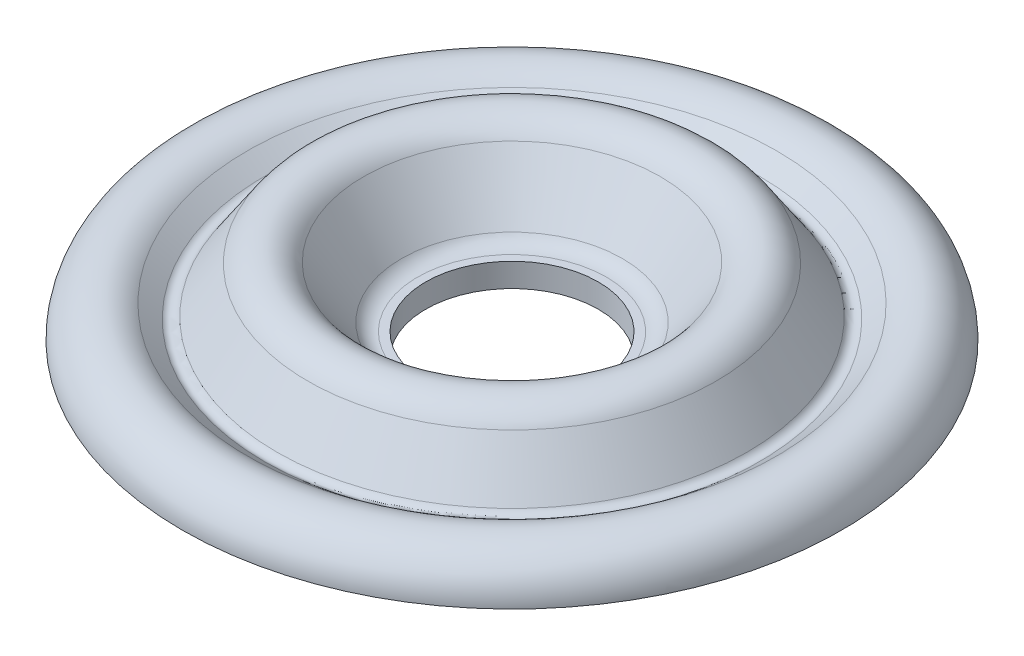
ISO-10303-21;
HEADER;
FILE_DESCRIPTION(('STEP AP214'),'2;1');
FILE_NAME('part.step','',(''),(''),'','','');
FILE_SCHEMA(('AUTOMOTIVE_DESIGN { 1 0 10303 214 1 1 1 1 }'));
ENDSEC;
DATA;
#1=APPLICATION_CONTEXT('core data for automotive mechanical design processes');
#2=APPLICATION_PROTOCOL_DEFINITION('international standard','automotive_design',2000,#1);
#3=PRODUCT_CONTEXT('',#1,'mechanical');
#4=PRODUCT('Part','Part','',(#3));
#5=PRODUCT_RELATED_PRODUCT_CATEGORY('part','',(#4));
#6=PRODUCT_DEFINITION_FORMATION('','',#4);
#7=PRODUCT_DEFINITION_CONTEXT('part definition',#1,'design');
#8=PRODUCT_DEFINITION('design','',#6,#7);
#9=PRODUCT_DEFINITION_SHAPE('','',#8);
#10=(LENGTH_UNIT() NAMED_UNIT(*) SI_UNIT(.MILLI.,.METRE.));
#11=(NAMED_UNIT(*) PLANE_ANGLE_UNIT() SI_UNIT($,.RADIAN.));
#12=(NAMED_UNIT(*) SI_UNIT($,.STERADIAN.) SOLID_ANGLE_UNIT());
#13=UNCERTAINTY_MEASURE_WITH_UNIT(LENGTH_MEASURE(1.E-05),#10,'distance_accuracy_value','');
#14=(GEOMETRIC_REPRESENTATION_CONTEXT(3) GLOBAL_UNCERTAINTY_ASSIGNED_CONTEXT((#13)) GLOBAL_UNIT_ASSIGNED_CONTEXT((#10,
#11,#12)) REPRESENTATION_CONTEXT('',''));
#15=CARTESIAN_POINT('',(0.,0.,0.));
#16=DIRECTION('',(0.,0.,1.));
#17=DIRECTION('',(1.,0.,0.));
#18=AXIS2_PLACEMENT_3D('',#15,#16,#17);
#19=CARTESIAN_POINT('',(-5.0527409529058,-3.99223268207169,0.));
#20=DIRECTION('',(0.,-1.,0.));
#21=DIRECTION('',(0.,0.,-1.));
#22=AXIS2_PLACEMENT_3D('',#19,#20,#21);
#23=PLANE('',#22);
#24=CARTESIAN_POINT('',(-10.6089909529058,-3.99223268207169,0.));
#25=DIRECTION('',(0.,-1.,0.));
#26=DIRECTION('',(0.,0.,-1.));
#27=AXIS2_PLACEMENT_3D('',#24,#25,#26);
#28=CIRCLE('',#27,6.8625004061052);
#29=CARTESIAN_POINT('',(-10.6089909529058,-3.99223268207169,-6.8625004061052));
#30=VERTEX_POINT('',#29);
#31=EDGE_CURVE('E10',#30,#30,#28,.T.);
#32=ORIENTED_EDGE('',*,*,#31,.T.);
#33=EDGE_LOOP('',(#32));
#34=FACE_BOUND('',#33,.T.);
#35=CARTESIAN_POINT('',(-10.6089909529058,-3.99223268207169,0.));
#36=DIRECTION('',(0.,-1.,0.));
#37=DIRECTION('',(0.,0.,-1.));
#38=AXIS2_PLACEMENT_3D('',#35,#36,#37);
#39=CIRCLE('',#38,5.55625);
#40=CARTESIAN_POINT('',(-10.6089909529058,-3.99223268207169,-5.55625));
#41=VERTEX_POINT('',#40);
#42=EDGE_CURVE('E73',#41,#41,#39,.T.);
#43=ORIENTED_EDGE('',*,*,#42,.F.);
#44=EDGE_LOOP('',(#43));
#45=FACE_BOUND('',#44,.T.);
#46=ADVANCED_FACE('F15',(#34,#45),#23,.T.);
#47=CARTESIAN_POINT('',(-10.6089909529058,-2.7222326820717,0.));
#48=DIRECTION('',(0.,-1.,0.));
#49=DIRECTION('',(0.,0.,-1.));
#50=AXIS2_PLACEMENT_3D('',#47,#48,#49);
#51=TOROIDAL_SURFACE('',#50,6.8625004061052,1.27);
#52=CARTESIAN_POINT('',(-10.6089909529058,-3.46828404546779,0.));
#53=DIRECTION('',(0.,-1.,0.));
#54=DIRECTION('',(0.,0.,-1.));
#55=AXIS2_PLACEMENT_3D('',#52,#53,#54);
#56=CIRCLE('',#55,7.89026855270969);
#57=CARTESIAN_POINT('',(-10.6089909529058,-3.46828404546779,-7.89026855270969));
#58=VERTEX_POINT('',#57);
#59=EDGE_CURVE('E21',#58,#58,#56,.T.);
#60=ORIENTED_EDGE('',*,*,#59,.T.);
#61=EDGE_LOOP('',(#60));
#62=FACE_BOUND('',#61,.T.);
#63=ORIENTED_EDGE('',*,*,#31,.F.);
#64=EDGE_LOOP('',(#63));
#65=FACE_BOUND('',#64,.T.);
#66=ADVANCED_FACE('F81',(#62,#65),#51,.T.);
#67=CARTESIAN_POINT('',(-10.6089909529058,-3.46828404546779,0.));
#68=DIRECTION('',(0.,1.,0.));
#69=DIRECTION('',(0.,0.,1.));
#70=AXIS2_PLACEMENT_3D('',#67,#68,#69);
#71=CONICAL_SURFACE('',#70,7.89026855270969,0.627894335676858);
#72=CARTESIAN_POINT('',(-10.6089909529058,0.514127236647869,0.));
#73=DIRECTION('',(0.,-1.,0.));
#74=DIRECTION('',(0.,0.,-1.));
#75=AXIS2_PLACEMENT_3D('',#72,#73,#74);
#76=CIRCLE('',#75,10.7810794583037);
#77=CARTESIAN_POINT('',(-10.6089909529058,0.514127236647869,-10.7810794583037));
#78=VERTEX_POINT('',#77);
#79=EDGE_CURVE('E25',#78,#78,#76,.T.);
#80=ORIENTED_EDGE('',*,*,#79,.T.);
#81=EDGE_LOOP('',(#80));
#82=FACE_BOUND('',#81,.T.);
#83=ORIENTED_EDGE('',*,*,#59,.F.);
#84=EDGE_LOOP('',(#83));
#85=FACE_BOUND('',#84,.T.);
#86=ADVANCED_FACE('F87',(#82,#85),#71,.T.);
#87=CARTESIAN_POINT('',(-10.6089909529058,0.12275009905327,0.));
#88=DIRECTION('',(0.,-1.,0.));
#89=DIRECTION('',(0.,0.,-1.));
#90=AXIS2_PLACEMENT_3D('',#87,#88,#89);
#91=TOROIDAL_SURFACE('',#90,11.3202446888287,0.66623960377543);
#92=CARTESIAN_POINT('',(-10.6089909529058,0.493030557397661,0.));
#93=DIRECTION('',(0.,-1.,0.));
#94=DIRECTION('',(0.,0.,-1.));
#95=AXIS2_PLACEMENT_3D('',#92,#93,#94);
#96=CIRCLE('',#95,11.8741107302206);
#97=CARTESIAN_POINT('',(-10.6089909529058,0.493030557397661,-11.8741107302206));
#98=VERTEX_POINT('',#97);
#99=EDGE_CURVE('E29',#98,#98,#96,.T.);
#100=ORIENTED_EDGE('',*,*,#99,.T.);
#101=EDGE_LOOP('',(#100));
#102=FACE_BOUND('',#101,.T.);
#103=ORIENTED_EDGE('',*,*,#79,.F.);
#104=EDGE_LOOP('',(#103));
#105=FACE_BOUND('',#104,.T.);
#106=ADVANCED_FACE('F92',(#102,#105),#91,.F.);
#107=CARTESIAN_POINT('',(-10.6089909529058,0.493030557397661,0.));
#108=DIRECTION('',(0.,-1.,0.));
#109=DIRECTION('',(0.,0.,-1.));
#110=AXIS2_PLACEMENT_3D('',#107,#108,#109);
#111=CONICAL_SURFACE('',#110,11.8741107302206,0.589296976842642);
#112=CARTESIAN_POINT('',(-10.6089909529058,-2.47664748925944,0.));
#113=DIRECTION('',(0.,-1.,0.));
#114=DIRECTION('',(0.,0.,-1.));
#115=AXIS2_PLACEMENT_3D('',#112,#113,#114);
#116=CIRCLE('',#115,13.8594531525293);
#117=CARTESIAN_POINT('',(-10.6089909529058,-2.47664748925944,-13.8594531525293));
#118=VERTEX_POINT('',#117);
#119=EDGE_CURVE('E34',#118,#118,#116,.T.);
#120=ORIENTED_EDGE('',*,*,#119,.T.);
#121=EDGE_LOOP('',(#120));
#122=FACE_BOUND('',#121,.T.);
#123=ORIENTED_EDGE('',*,*,#99,.F.);
#124=EDGE_LOOP('',(#123));
#125=FACE_BOUND('',#124,.T.);
#126=ADVANCED_FACE('F99',(#122,#125),#111,.F.);
#127=CARTESIAN_POINT('',(-10.6089909529058,-1.32299305393023,0.));
#128=DIRECTION('',(0.,-1.,0.));
#129=DIRECTION('',(0.,0.,-1.));
#130=AXIS2_PLACEMENT_3D('',#127,#128,#129);
#131=TOROIDAL_SURFACE('',#130,15.5850911137843,2.07575165409519);
#132=CARTESIAN_POINT('',(-10.6089909529058,-2.95819426321548,0.));
#133=DIRECTION('',(0.,-1.,0.));
#134=DIRECTION('',(0.,0.,-1.));
#135=AXIS2_PLACEMENT_3D('',#132,#133,#134);
#136=CIRCLE('',#135,16.8637083100674);
#137=CARTESIAN_POINT('',(-10.6089909529058,-2.95819426321548,-16.8637083100674));
#138=VERTEX_POINT('',#137);
#139=EDGE_CURVE('E37',#138,#138,#136,.T.);
#140=ORIENTED_EDGE('',*,*,#139,.T.);
#141=EDGE_LOOP('',(#140));
#142=FACE_BOUND('',#141,.T.);
#143=ORIENTED_EDGE('',*,*,#119,.F.);
#144=EDGE_LOOP('',(#143));
#145=FACE_BOUND('',#144,.T.);
#146=ADVANCED_FACE('F103',(#142,#145),#131,.T.);
#147=CARTESIAN_POINT('',(-10.6089909529058,-2.95819426321548,0.));
#148=DIRECTION('',(0.,1.,0.));
#149=DIRECTION('',(0.,0.,1.));
#150=AXIS2_PLACEMENT_3D('',#147,#148,#149);
#151=CONICAL_SURFACE('',#150,16.8637083100674,0.907813766704119);
#152=CARTESIAN_POINT('',(-10.6089909529058,-2.12043297998714,0.));
#153=DIRECTION('',(0.,-1.,0.));
#154=DIRECTION('',(0.,0.,-1.));
#155=AXIS2_PLACEMENT_3D('',#152,#153,#154);
#156=CIRCLE('',#155,17.9365301232134);
#157=CARTESIAN_POINT('',(-10.6089909529058,-2.12043297998714,-17.9365301232134));
#158=VERTEX_POINT('',#157);
#159=EDGE_CURVE('E40',#158,#158,#156,.T.);
#160=ORIENTED_EDGE('',*,*,#159,.T.);
#161=EDGE_LOOP('',(#160));
#162=FACE_BOUND('',#161,.T.);
#163=ORIENTED_EDGE('',*,*,#139,.F.);
#164=EDGE_LOOP('',(#163));
#165=FACE_BOUND('',#164,.T.);
#166=ADVANCED_FACE('F107',(#162,#165),#151,.T.);
#167=CARTESIAN_POINT('',(-10.6089909529058,-2.93349039197841,0.));
#168=DIRECTION('',(0.,-1.,0.));
#169=DIRECTION('',(0.,0.,-1.));
#170=AXIS2_PLACEMENT_3D('',#167,#168,#169);
#171=TOROIDAL_SURFACE('',#170,18.6271819058116,1.0668);
#172=CARTESIAN_POINT('',(-10.6089909529058,-2.93349039197841,0.));
#173=DIRECTION('',(0.,-1.,0.));
#174=DIRECTION('',(0.,0.,-1.));
#175=AXIS2_PLACEMENT_3D('',#172,#173,#174);
#176=CIRCLE('',#175,19.6939819058116);
#177=CARTESIAN_POINT('',(-10.6089909529058,-2.93349039197841,-19.6939819058116));
#178=VERTEX_POINT('',#177);
#179=EDGE_CURVE('E43',#178,#178,#176,.T.);
#180=ORIENTED_EDGE('',*,*,#179,.T.);
#181=EDGE_LOOP('',(#180));
#182=FACE_BOUND('',#181,.T.);
#183=ORIENTED_EDGE('',*,*,#159,.F.);
#184=EDGE_LOOP('',(#183));
#185=FACE_BOUND('',#184,.T.);
#186=ADVANCED_FACE('F111',(#182,#185),#171,.F.);
#187=CARTESIAN_POINT('',(10.6089909529058,-2.9334903919784,0.));
#188=DIRECTION('',(0.,-1.,0.));
#189=DIRECTION('',(0.,0.,-1.));
#190=AXIS2_PLACEMENT_3D('',#187,#188,#189);
#191=PLANE('',#190);
#192=CARTESIAN_POINT('',(-10.6089909529058,-2.93349039197839,0.));
#193=DIRECTION('',(0.,-1.,0.));
#194=DIRECTION('',(0.,0.,-1.));
#195=AXIS2_PLACEMENT_3D('',#192,#193,#194);
#196=CIRCLE('',#195,21.2179819058116);
#197=CARTESIAN_POINT('',(-10.6089909529058,-2.93349039197839,-21.2179819058116));
#198=VERTEX_POINT('',#197);
#199=EDGE_CURVE('E46',#198,#198,#196,.T.);
#200=ORIENTED_EDGE('',*,*,#199,.T.);
#201=EDGE_LOOP('',(#200));
#202=FACE_BOUND('',#201,.T.);
#203=ORIENTED_EDGE('',*,*,#179,.F.);
#204=EDGE_LOOP('',(#203));
#205=FACE_BOUND('',#204,.T.);
#206=ADVANCED_FACE('F115',(#202,#205),#191,.T.);
#207=CARTESIAN_POINT('',(-10.6089909529058,-2.93349039197841,0.));
#208=DIRECTION('',(0.,-1.,0.));
#209=DIRECTION('',(0.,0.,-1.));
#210=AXIS2_PLACEMENT_3D('',#207,#208,#209);
#211=TOROIDAL_SURFACE('',#210,18.6271819058116,2.59080000000004);
#212=CARTESIAN_POINT('',(-10.6089909529058,-0.892552939437658,0.));
#213=DIRECTION('',(0.,-1.,0.));
#214=DIRECTION('',(0.,0.,-1.));
#215=AXIS2_PLACEMENT_3D('',#212,#213,#214);
#216=CIRCLE('',#215,17.0313062982479);
#217=CARTESIAN_POINT('',(-10.6089909529058,-0.892552939437658,-17.0313062982479));
#218=VERTEX_POINT('',#217);
#219=EDGE_CURVE('E49',#218,#218,#216,.T.);
#220=ORIENTED_EDGE('',*,*,#219,.T.);
#221=EDGE_LOOP('',(#220));
#222=FACE_BOUND('',#221,.T.);
#223=ORIENTED_EDGE('',*,*,#199,.F.);
#224=EDGE_LOOP('',(#223));
#225=FACE_BOUND('',#224,.T.);
#226=ADVANCED_FACE('F119',(#222,#225),#211,.T.);
#227=CARTESIAN_POINT('',(-10.6089909529058,-0.892552939437658,0.));
#228=DIRECTION('',(0.,1.,0.));
#229=DIRECTION('',(0.,0.,1.));
#230=AXIS2_PLACEMENT_3D('',#227,#228,#229);
#231=CONICAL_SURFACE('',#230,17.0313062982479,0.907169567865759);
#232=CARTESIAN_POINT('',(-10.6089909529058,-1.75764282054446,0.));
#233=DIRECTION('',(0.,-1.,0.));
#234=DIRECTION('',(0.,0.,-1.));
#235=AXIS2_PLACEMENT_3D('',#232,#233,#234);
#236=CIRCLE('',#235,15.924957952677);
#237=CARTESIAN_POINT('',(-10.6089909529058,-1.75764282054446,-15.924957952677));
#238=VERTEX_POINT('',#237);
#239=EDGE_CURVE('E52',#238,#238,#236,.T.);
#240=ORIENTED_EDGE('',*,*,#239,.T.);
#241=EDGE_LOOP('',(#240));
#242=FACE_BOUND('',#241,.T.);
#243=ORIENTED_EDGE('',*,*,#219,.F.);
#244=EDGE_LOOP('',(#243));
#245=FACE_BOUND('',#244,.T.);
#246=ADVANCED_FACE('F123',(#242,#245),#231,.F.);
#247=CARTESIAN_POINT('',(-10.6089909529058,-1.32299305393023,0.));
#248=DIRECTION('',(0.,-1.,0.));
#249=DIRECTION('',(0.,0.,-1.));
#250=AXIS2_PLACEMENT_3D('',#247,#248,#249);
#251=TOROIDAL_SURFACE('',#250,15.5850911137843,0.551751654095177);
#252=CARTESIAN_POINT('',(-10.6089909529058,-1.62964377570195,0.));
#253=DIRECTION('',(0.,-1.,0.));
#254=DIRECTION('',(0.,0.,-1.));
#255=AXIS2_PLACEMENT_3D('',#252,#253,#254);
#256=CIRCLE('',#255,15.1264025237435);
#257=CARTESIAN_POINT('',(-10.6089909529058,-1.62964377570195,-15.1264025237435));
#258=VERTEX_POINT('',#257);
#259=EDGE_CURVE('E55',#258,#258,#256,.T.);
#260=ORIENTED_EDGE('',*,*,#259,.T.);
#261=EDGE_LOOP('',(#260));
#262=FACE_BOUND('',#261,.T.);
#263=ORIENTED_EDGE('',*,*,#239,.F.);
#264=EDGE_LOOP('',(#263));
#265=FACE_BOUND('',#264,.T.);
#266=ADVANCED_FACE('F127',(#262,#265),#251,.F.);
#267=CARTESIAN_POINT('',(-10.6089909529058,-1.62964377570195,0.));
#268=DIRECTION('',(0.,-1.,0.));
#269=DIRECTION('',(0.,0.,-1.));
#270=AXIS2_PLACEMENT_3D('',#267,#268,#269);
#271=CONICAL_SURFACE('',#270,15.1264025237435,0.589296976842644);
#272=CARTESIAN_POINT('',(-10.6089909529058,1.34003427095516,0.));
#273=DIRECTION('',(0.,-1.,0.));
#274=DIRECTION('',(0.,0.,-1.));
#275=AXIS2_PLACEMENT_3D('',#272,#273,#274);
#276=CIRCLE('',#275,13.1410601014347);
#277=CARTESIAN_POINT('',(-10.6089909529058,1.34003427095516,-13.1410601014347));
#278=VERTEX_POINT('',#277);
#279=EDGE_CURVE('E58',#278,#278,#276,.T.);
#280=ORIENTED_EDGE('',*,*,#279,.T.);
#281=EDGE_LOOP('',(#280));
#282=FACE_BOUND('',#281,.T.);
#283=ORIENTED_EDGE('',*,*,#259,.F.);
#284=EDGE_LOOP('',(#283));
#285=FACE_BOUND('',#284,.T.);
#286=ADVANCED_FACE('F131',(#282,#285),#271,.T.);
#287=CARTESIAN_POINT('',(-10.6089909529058,0.12275009905327,0.));
#288=DIRECTION('',(0.,-1.,0.));
#289=DIRECTION('',(0.,0.,-1.));
#290=AXIS2_PLACEMENT_3D('',#287,#288,#289);
#291=TOROIDAL_SURFACE('',#290,11.3202446888287,2.19023960377543);
#292=CARTESIAN_POINT('',(-10.6089909529058,1.40938887272318,0.));
#293=DIRECTION('',(0.,-1.,0.));
#294=DIRECTION('',(0.,0.,-1.));
#295=AXIS2_PLACEMENT_3D('',#292,#293,#294);
#296=CIRCLE('',#295,9.54775768237831);
#297=CARTESIAN_POINT('',(-10.6089909529058,1.40938887272318,-9.54775768237831));
#298=VERTEX_POINT('',#297);
#299=EDGE_CURVE('E61',#298,#298,#296,.T.);
#300=ORIENTED_EDGE('',*,*,#299,.T.);
#301=EDGE_LOOP('',(#300));
#302=FACE_BOUND('',#301,.T.);
#303=ORIENTED_EDGE('',*,*,#279,.F.);
#304=EDGE_LOOP('',(#303));
#305=FACE_BOUND('',#304,.T.);
#306=ADVANCED_FACE('F135',(#302,#305),#291,.T.);
#307=CARTESIAN_POINT('',(-10.6089909529058,1.40938887272318,0.));
#308=DIRECTION('',(0.,1.,0.));
#309=DIRECTION('',(0.,0.,1.));
#310=AXIS2_PLACEMENT_3D('',#307,#308,#309);
#311=CONICAL_SURFACE('',#310,9.54775768237831,0.627894335676859);
#312=CARTESIAN_POINT('',(-10.6089909529058,-1.94428404546779,0.));
#313=DIRECTION('',(0.,-1.,0.));
#314=DIRECTION('',(0.,0.,-1.));
#315=AXIS2_PLACEMENT_3D('',#312,#313,#314);
#316=CIRCLE('',#315,7.11334456958917);
#317=CARTESIAN_POINT('',(-10.6089909529058,-1.94428404546779,-7.11334456958917));
#318=VERTEX_POINT('',#317);
#319=EDGE_CURVE('E64',#318,#318,#316,.T.);
#320=ORIENTED_EDGE('',*,*,#319,.T.);
#321=EDGE_LOOP('',(#320));
#322=FACE_BOUND('',#321,.T.);
#323=ORIENTED_EDGE('',*,*,#299,.F.);
#324=EDGE_LOOP('',(#323));
#325=FACE_BOUND('',#324,.T.);
#326=ADVANCED_FACE('F139',(#322,#325),#311,.F.);
#327=CARTESIAN_POINT('',(-10.6089909529058,-1.1982326820717,0.));
#328=DIRECTION('',(0.,-1.,0.));
#329=DIRECTION('',(0.,0.,-1.));
#330=AXIS2_PLACEMENT_3D('',#327,#328,#329);
#331=TOROIDAL_SURFACE('',#330,6.08557642298468,1.27);
#332=CARTESIAN_POINT('',(-10.6089909529058,-2.46823268207169,0.));
#333=DIRECTION('',(0.,-1.,0.));
#334=DIRECTION('',(0.,0.,-1.));
#335=AXIS2_PLACEMENT_3D('',#332,#333,#334);
#336=CIRCLE('',#335,6.08557642298467);
#337=CARTESIAN_POINT('',(-10.6089909529058,-2.46823268207169,-6.08557642298467));
#338=VERTEX_POINT('',#337);
#339=EDGE_CURVE('E67',#338,#338,#336,.T.);
#340=ORIENTED_EDGE('',*,*,#339,.T.);
#341=EDGE_LOOP('',(#340));
#342=FACE_BOUND('',#341,.T.);
#343=ORIENTED_EDGE('',*,*,#319,.F.);
#344=EDGE_LOOP('',(#343));
#345=FACE_BOUND('',#344,.T.);
#346=ADVANCED_FACE('F143',(#342,#345),#331,.F.);
#347=CARTESIAN_POINT('',(-5.0527409529058,-2.46823268207169,0.));
#348=DIRECTION('',(0.,1.,0.));
#349=DIRECTION('',(0.,0.,1.));
#350=AXIS2_PLACEMENT_3D('',#347,#348,#349);
#351=PLANE('',#350);
#352=CARTESIAN_POINT('',(-10.6089909529058,-2.46823268207169,0.));
#353=DIRECTION('',(0.,-1.,0.));
#354=DIRECTION('',(0.,0.,-1.));
#355=AXIS2_PLACEMENT_3D('',#352,#353,#354);
#356=CIRCLE('',#355,5.55625);
#357=CARTESIAN_POINT('',(-10.6089909529058,-2.46823268207169,-5.55625));
#358=VERTEX_POINT('',#357);
#359=EDGE_CURVE('E70',#358,#358,#356,.T.);
#360=ORIENTED_EDGE('',*,*,#359,.T.);
#361=EDGE_LOOP('',(#360));
#362=FACE_BOUND('',#361,.T.);
#363=ORIENTED_EDGE('',*,*,#339,.F.);
#364=EDGE_LOOP('',(#363));
#365=FACE_BOUND('',#364,.T.);
#366=ADVANCED_FACE('F147',(#362,#365),#351,.T.);
#367=CARTESIAN_POINT('',(-10.6089909529058,-3.99223268207169,0.));
#368=DIRECTION('',(0.,-1.,0.));
#369=DIRECTION('',(0.,0.,-1.));
#370=AXIS2_PLACEMENT_3D('',#367,#368,#369);
#371=CYLINDRICAL_SURFACE('',#370,5.55625);
#372=ORIENTED_EDGE('',*,*,#42,.T.);
#373=EDGE_LOOP('',(#372));
#374=FACE_BOUND('',#373,.T.);
#375=ORIENTED_EDGE('',*,*,#359,.F.);
#376=EDGE_LOOP('',(#375));
#377=FACE_BOUND('',#376,.T.);
#378=ADVANCED_FACE('F77',(#374,#377),#371,.F.);
#379=CLOSED_SHELL('',(#46,#66,#86,#106,#126,#146,#166,#186,#206,#226,#246,#266,#286,#306,#326,
#346,#366,#378));
#380=MANIFOLD_SOLID_BREP('B1',#379);
#381=ADVANCED_BREP_SHAPE_REPRESENTATION('',(#18,#380),#14);
#382=SHAPE_DEFINITION_REPRESENTATION(#9,#381);
ENDSEC;
END-ISO-10303-21;
